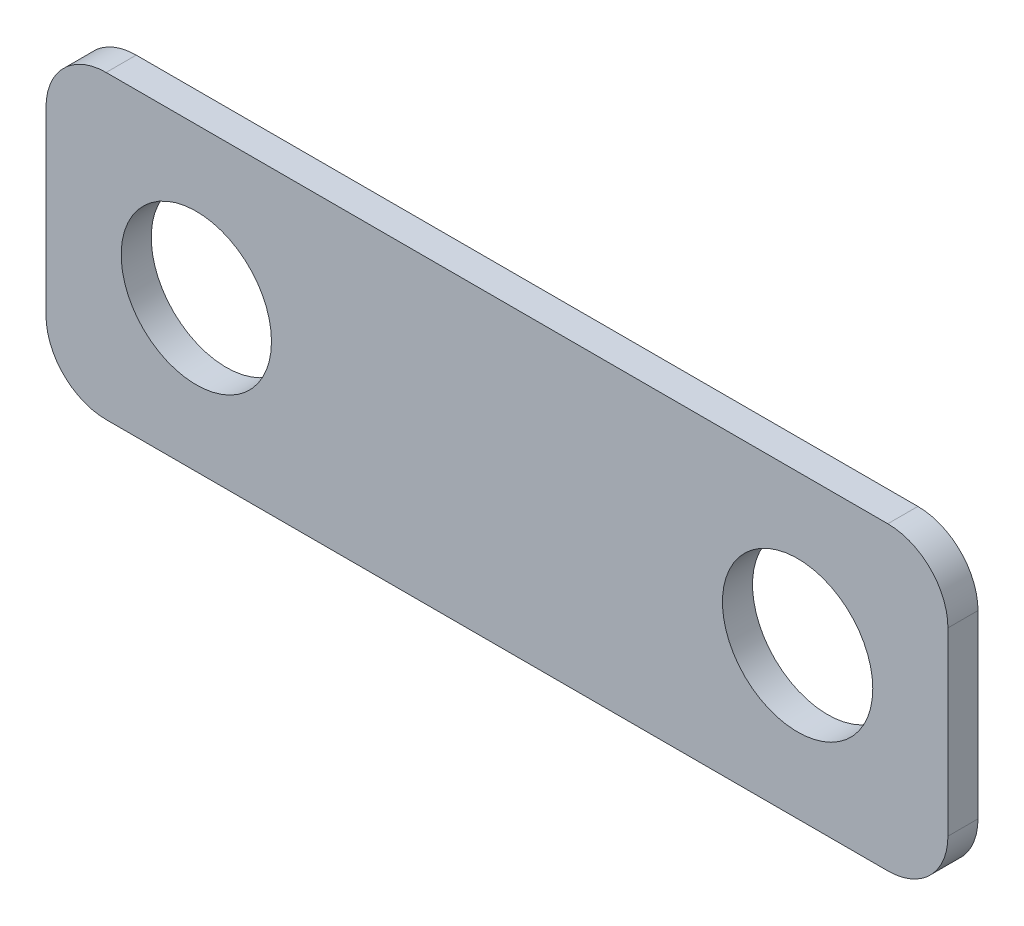
ISO-10303-21;
HEADER;
FILE_DESCRIPTION(('STEP AP214'),'2;1');
FILE_NAME('part.step','',(''),(''),'','','');
FILE_SCHEMA(('AUTOMOTIVE_DESIGN { 1 0 10303 214 1 1 1 1 }'));
ENDSEC;
DATA;
#1=APPLICATION_CONTEXT('core data for automotive mechanical design processes');
#2=APPLICATION_PROTOCOL_DEFINITION('international standard','automotive_design',2000,#1);
#3=PRODUCT_CONTEXT('',#1,'mechanical');
#4=PRODUCT('Part','Part','',(#3));
#5=PRODUCT_RELATED_PRODUCT_CATEGORY('part','',(#4));
#6=PRODUCT_DEFINITION_FORMATION('','',#4);
#7=PRODUCT_DEFINITION_CONTEXT('part definition',#1,'design');
#8=PRODUCT_DEFINITION('design','',#6,#7);
#9=PRODUCT_DEFINITION_SHAPE('','',#8);
#10=(LENGTH_UNIT() NAMED_UNIT(*) SI_UNIT(.MILLI.,.METRE.));
#11=(NAMED_UNIT(*) PLANE_ANGLE_UNIT() SI_UNIT($,.RADIAN.));
#12=(NAMED_UNIT(*) SI_UNIT($,.STERADIAN.) SOLID_ANGLE_UNIT());
#13=UNCERTAINTY_MEASURE_WITH_UNIT(LENGTH_MEASURE(1.E-05),#10,'distance_accuracy_value','');
#14=(GEOMETRIC_REPRESENTATION_CONTEXT(3) GLOBAL_UNCERTAINTY_ASSIGNED_CONTEXT((#13)) GLOBAL_UNIT_ASSIGNED_CONTEXT((#10,
#11,#12)) REPRESENTATION_CONTEXT('',''));
#15=CARTESIAN_POINT('',(0.,0.,0.));
#16=DIRECTION('',(0.,0.,1.));
#17=DIRECTION('',(1.,0.,0.));
#18=AXIS2_PLACEMENT_3D('',#15,#16,#17);
#19=CARTESIAN_POINT('',(13.,3.,1.));
#20=DIRECTION('',(0.,0.,-1.));
#21=DIRECTION('',(-1.,0.,0.));
#22=AXIS2_PLACEMENT_3D('',#19,#20,#21);
#23=PLANE('',#22);
#24=CARTESIAN_POINT('',(13.,3.,1.));
#25=DIRECTION('',(0.,0.,1.));
#26=DIRECTION('',(-1.,0.,0.));
#27=AXIS2_PLACEMENT_3D('',#24,#25,#26);
#28=CIRCLE('',#27,2.);
#29=CARTESIAN_POINT('',(15.,3.,1.));
#30=VERTEX_POINT('',#29);
#31=CARTESIAN_POINT('',(13.,5.,1.));
#32=VERTEX_POINT('',#31);
#33=EDGE_CURVE('E146',#30,#32,#28,.T.);
#34=ORIENTED_EDGE('',*,*,#33,.T.);
#35=DIRECTION('',(-1.,0.,0.));
#36=VECTOR('',#35,1.);
#37=CARTESIAN_POINT('',(-13.,5.,1.));
#38=LINE('',#37,#36);
#39=CARTESIAN_POINT('',(-13.,5.,1.));
#40=VERTEX_POINT('',#39);
#41=EDGE_CURVE('E94',#32,#40,#38,.T.);
#42=ORIENTED_EDGE('',*,*,#41,.T.);
#43=CARTESIAN_POINT('',(-13.,3.,1.));
#44=DIRECTION('',(0.,0.,1.));
#45=DIRECTION('',(-1.,0.,0.));
#46=AXIS2_PLACEMENT_3D('',#43,#44,#45);
#47=CIRCLE('',#46,2.);
#48=CARTESIAN_POINT('',(-15.,3.,1.));
#49=VERTEX_POINT('',#48);
#50=EDGE_CURVE('E161',#40,#49,#47,.T.);
#51=ORIENTED_EDGE('',*,*,#50,.T.);
#52=DIRECTION('',(0.,-1.,0.));
#53=VECTOR('',#52,1.);
#54=CARTESIAN_POINT('',(-15.,-3.,1.));
#55=LINE('',#54,#53);
#56=CARTESIAN_POINT('',(-15.,-3.,1.));
#57=VERTEX_POINT('',#56);
#58=EDGE_CURVE('E174',#49,#57,#55,.T.);
#59=ORIENTED_EDGE('',*,*,#58,.T.);
#60=CARTESIAN_POINT('',(-13.,-3.,1.));
#61=DIRECTION('',(0.,0.,1.));
#62=DIRECTION('',(-1.,0.,0.));
#63=AXIS2_PLACEMENT_3D('',#60,#61,#62);
#64=CIRCLE('',#63,2.);
#65=CARTESIAN_POINT('',(-13.,-5.,1.));
#66=VERTEX_POINT('',#65);
#67=EDGE_CURVE('E113',#57,#66,#64,.T.);
#68=ORIENTED_EDGE('',*,*,#67,.T.);
#69=DIRECTION('',(1.,0.,0.));
#70=VECTOR('',#69,1.);
#71=CARTESIAN_POINT('',(-13.,-5.,1.));
#72=LINE('',#71,#70);
#73=CARTESIAN_POINT('',(13.,-5.,1.));
#74=VERTEX_POINT('',#73);
#75=EDGE_CURVE('E107',#66,#74,#72,.T.);
#76=ORIENTED_EDGE('',*,*,#75,.T.);
#77=CARTESIAN_POINT('',(13.,-3.,1.));
#78=DIRECTION('',(0.,0.,1.));
#79=DIRECTION('',(1.,0.,0.));
#80=AXIS2_PLACEMENT_3D('',#77,#78,#79);
#81=CIRCLE('',#80,2.);
#82=CARTESIAN_POINT('',(15.,-3.,1.));
#83=VERTEX_POINT('',#82);
#84=EDGE_CURVE('E111',#74,#83,#81,.T.);
#85=ORIENTED_EDGE('',*,*,#84,.T.);
#86=DIRECTION('',(0.,1.,0.));
#87=VECTOR('',#86,1.);
#88=CARTESIAN_POINT('',(15.,-3.,1.));
#89=LINE('',#88,#87);
#90=EDGE_CURVE('E51',#83,#30,#89,.T.);
#91=ORIENTED_EDGE('',*,*,#90,.T.);
#92=EDGE_LOOP('',(#34,#42,#51,#59,#68,#76,#85,#91));
#93=FACE_BOUND('',#92,.T.);
#94=CARTESIAN_POINT('',(-10.,0.,1.));
#95=DIRECTION('',(0.,0.,1.));
#96=DIRECTION('',(1.,0.,0.));
#97=AXIS2_PLACEMENT_3D('',#94,#95,#96);
#98=CIRCLE('',#97,2.5);
#99=CARTESIAN_POINT('',(-7.5,0.,1.));
#100=VERTEX_POINT('',#99);
#101=EDGE_CURVE('E135',#100,#100,#98,.T.);
#102=ORIENTED_EDGE('',*,*,#101,.F.);
#103=EDGE_LOOP('',(#102));
#104=FACE_BOUND('',#103,.T.);
#105=CARTESIAN_POINT('',(10.,0.,1.));
#106=DIRECTION('',(0.,0.,1.));
#107=DIRECTION('',(1.,0.,0.));
#108=AXIS2_PLACEMENT_3D('',#105,#106,#107);
#109=CIRCLE('',#108,2.5);
#110=CARTESIAN_POINT('',(12.5,0.,1.));
#111=VERTEX_POINT('',#110);
#112=EDGE_CURVE('E183',#111,#111,#109,.T.);
#113=ORIENTED_EDGE('',*,*,#112,.F.);
#114=EDGE_LOOP('',(#113));
#115=FACE_BOUND('',#114,.T.);
#116=ADVANCED_FACE('F34',(#93,#104,#115),#23,.F.);
#117=CARTESIAN_POINT('',(13.,3.,0.));
#118=DIRECTION('',(0.,0.,-1.));
#119=DIRECTION('',(-1.,0.,0.));
#120=AXIS2_PLACEMENT_3D('',#117,#118,#119);
#121=PLANE('',#120);
#122=CARTESIAN_POINT('',(-10.,0.,0.));
#123=DIRECTION('',(0.,0.,1.));
#124=DIRECTION('',(1.,0.,0.));
#125=AXIS2_PLACEMENT_3D('',#122,#123,#124);
#126=CIRCLE('',#125,2.5);
#127=CARTESIAN_POINT('',(-7.5,0.,0.));
#128=VERTEX_POINT('',#127);
#129=EDGE_CURVE('E180',#128,#128,#126,.T.);
#130=ORIENTED_EDGE('',*,*,#129,.T.);
#131=EDGE_LOOP('',(#130));
#132=FACE_BOUND('',#131,.T.);
#133=CARTESIAN_POINT('',(13.,3.,0.));
#134=DIRECTION('',(0.,0.,1.));
#135=DIRECTION('',(-1.,0.,0.));
#136=AXIS2_PLACEMENT_3D('',#133,#134,#135);
#137=CIRCLE('',#136,2.);
#138=CARTESIAN_POINT('',(15.,3.,0.));
#139=VERTEX_POINT('',#138);
#140=CARTESIAN_POINT('',(13.,5.,0.));
#141=VERTEX_POINT('',#140);
#142=EDGE_CURVE('E131',#139,#141,#137,.T.);
#143=ORIENTED_EDGE('',*,*,#142,.F.);
#144=DIRECTION('',(0.,1.,0.));
#145=VECTOR('',#144,1.);
#146=CARTESIAN_POINT('',(15.,-3.,0.));
#147=LINE('',#146,#145);
#148=CARTESIAN_POINT('',(15.,-3.,0.));
#149=VERTEX_POINT('',#148);
#150=EDGE_CURVE('E86',#149,#139,#147,.T.);
#151=ORIENTED_EDGE('',*,*,#150,.F.);
#152=CARTESIAN_POINT('',(13.,-3.,0.));
#153=DIRECTION('',(0.,0.,1.));
#154=DIRECTION('',(1.,0.,0.));
#155=AXIS2_PLACEMENT_3D('',#152,#153,#154);
#156=CIRCLE('',#155,2.);
#157=CARTESIAN_POINT('',(13.,-5.,0.));
#158=VERTEX_POINT('',#157);
#159=EDGE_CURVE('E80',#158,#149,#156,.T.);
#160=ORIENTED_EDGE('',*,*,#159,.F.);
#161=DIRECTION('',(1.,0.,0.));
#162=VECTOR('',#161,1.);
#163=CARTESIAN_POINT('',(-13.,-5.,0.));
#164=LINE('',#163,#162);
#165=CARTESIAN_POINT('',(-13.,-5.,0.));
#166=VERTEX_POINT('',#165);
#167=EDGE_CURVE('E121',#166,#158,#164,.T.);
#168=ORIENTED_EDGE('',*,*,#167,.F.);
#169=CARTESIAN_POINT('',(-13.,-3.,0.));
#170=DIRECTION('',(0.,0.,1.));
#171=DIRECTION('',(-1.,0.,0.));
#172=AXIS2_PLACEMENT_3D('',#169,#170,#171);
#173=CIRCLE('',#172,2.);
#174=CARTESIAN_POINT('',(-15.,-3.,0.));
#175=VERTEX_POINT('',#174);
#176=EDGE_CURVE('E141',#175,#166,#173,.T.);
#177=ORIENTED_EDGE('',*,*,#176,.F.);
#178=DIRECTION('',(0.,-1.,0.));
#179=VECTOR('',#178,1.);
#180=CARTESIAN_POINT('',(-15.,-3.,0.));
#181=LINE('',#180,#179);
#182=CARTESIAN_POINT('',(-15.,3.,0.));
#183=VERTEX_POINT('',#182);
#184=EDGE_CURVE('E139',#183,#175,#181,.T.);
#185=ORIENTED_EDGE('',*,*,#184,.F.);
#186=CARTESIAN_POINT('',(-13.,3.,0.));
#187=DIRECTION('',(0.,0.,1.));
#188=DIRECTION('',(-1.,0.,0.));
#189=AXIS2_PLACEMENT_3D('',#186,#187,#188);
#190=CIRCLE('',#189,2.);
#191=CARTESIAN_POINT('',(-13.,5.,0.));
#192=VERTEX_POINT('',#191);
#193=EDGE_CURVE('E137',#192,#183,#190,.T.);
#194=ORIENTED_EDGE('',*,*,#193,.F.);
#195=DIRECTION('',(-1.,0.,0.));
#196=VECTOR('',#195,1.);
#197=CARTESIAN_POINT('',(-13.,5.,0.));
#198=LINE('',#197,#196);
#199=EDGE_CURVE('E134',#141,#192,#198,.T.);
#200=ORIENTED_EDGE('',*,*,#199,.F.);
#201=EDGE_LOOP('',(#143,#151,#160,#168,#177,#185,#194,#200));
#202=FACE_BOUND('',#201,.T.);
#203=CARTESIAN_POINT('',(10.,0.,0.));
#204=DIRECTION('',(0.,0.,1.));
#205=DIRECTION('',(1.,0.,0.));
#206=AXIS2_PLACEMENT_3D('',#203,#204,#205);
#207=CIRCLE('',#206,2.5);
#208=CARTESIAN_POINT('',(12.5,0.,0.));
#209=VERTEX_POINT('',#208);
#210=EDGE_CURVE('E186',#209,#209,#207,.T.);
#211=ORIENTED_EDGE('',*,*,#210,.T.);
#212=EDGE_LOOP('',(#211));
#213=FACE_BOUND('',#212,.T.);
#214=ADVANCED_FACE('F165',(#132,#202,#213),#121,.T.);
#215=CARTESIAN_POINT('',(13.,3.,1.));
#216=DIRECTION('',(0.,0.,-1.));
#217=DIRECTION('',(-1.,0.,0.));
#218=AXIS2_PLACEMENT_3D('',#215,#216,#217);
#219=CYLINDRICAL_SURFACE('',#218,2.);
#220=ORIENTED_EDGE('',*,*,#142,.T.);
#221=DIRECTION('',(0.,0.,-1.));
#222=VECTOR('',#221,1.);
#223=CARTESIAN_POINT('',(13.,5.,1.));
#224=LINE('',#223,#222);
#225=EDGE_CURVE('E11',#32,#141,#224,.T.);
#226=ORIENTED_EDGE('',*,*,#225,.F.);
#227=ORIENTED_EDGE('',*,*,#33,.F.);
#228=DIRECTION('',(0.,0.,-1.));
#229=VECTOR('',#228,1.);
#230=CARTESIAN_POINT('',(15.,3.,1.));
#231=LINE('',#230,#229);
#232=EDGE_CURVE('E127',#30,#139,#231,.T.);
#233=ORIENTED_EDGE('',*,*,#232,.T.);
#234=EDGE_LOOP('',(#220,#226,#227,#233));
#235=FACE_BOUND('',#234,.T.);
#236=ADVANCED_FACE('F36',(#235),#219,.T.);
#237=CARTESIAN_POINT('',(-13.,5.,1.));
#238=DIRECTION('',(0.,-1.,0.));
#239=DIRECTION('',(0.,0.,-1.));
#240=AXIS2_PLACEMENT_3D('',#237,#238,#239);
#241=PLANE('',#240);
#242=ORIENTED_EDGE('',*,*,#199,.T.);
#243=DIRECTION('',(0.,0.,-1.));
#244=VECTOR('',#243,1.);
#245=CARTESIAN_POINT('',(-13.,5.,1.));
#246=LINE('',#245,#244);
#247=EDGE_CURVE('E43',#40,#192,#246,.T.);
#248=ORIENTED_EDGE('',*,*,#247,.F.);
#249=ORIENTED_EDGE('',*,*,#41,.F.);
#250=ORIENTED_EDGE('',*,*,#225,.T.);
#251=EDGE_LOOP('',(#242,#248,#249,#250));
#252=FACE_BOUND('',#251,.T.);
#253=ADVANCED_FACE('F218',(#252),#241,.F.);
#254=CARTESIAN_POINT('',(-13.,3.,1.));
#255=DIRECTION('',(0.,0.,-1.));
#256=DIRECTION('',(-1.,0.,0.));
#257=AXIS2_PLACEMENT_3D('',#254,#255,#256);
#258=CYLINDRICAL_SURFACE('',#257,2.);
#259=ORIENTED_EDGE('',*,*,#193,.T.);
#260=DIRECTION('',(0.,0.,-1.));
#261=VECTOR('',#260,1.);
#262=CARTESIAN_POINT('',(-15.,3.,1.));
#263=LINE('',#262,#261);
#264=EDGE_CURVE('E153',#49,#183,#263,.T.);
#265=ORIENTED_EDGE('',*,*,#264,.F.);
#266=ORIENTED_EDGE('',*,*,#50,.F.);
#267=ORIENTED_EDGE('',*,*,#247,.T.);
#268=EDGE_LOOP('',(#259,#265,#266,#267));
#269=FACE_BOUND('',#268,.T.);
#270=ADVANCED_FACE('F159',(#269),#258,.T.);
#271=CARTESIAN_POINT('',(-15.,-3.,1.));
#272=DIRECTION('',(1.,0.,0.));
#273=DIRECTION('',(0.,0.,-1.));
#274=AXIS2_PLACEMENT_3D('',#271,#272,#273);
#275=PLANE('',#274);
#276=ORIENTED_EDGE('',*,*,#184,.T.);
#277=DIRECTION('',(0.,0.,-1.));
#278=VECTOR('',#277,1.);
#279=CARTESIAN_POINT('',(-15.,-3.,1.));
#280=LINE('',#279,#278);
#281=EDGE_CURVE('E150',#57,#175,#280,.T.);
#282=ORIENTED_EDGE('',*,*,#281,.F.);
#283=ORIENTED_EDGE('',*,*,#58,.F.);
#284=ORIENTED_EDGE('',*,*,#264,.T.);
#285=EDGE_LOOP('',(#276,#282,#283,#284));
#286=FACE_BOUND('',#285,.T.);
#287=ADVANCED_FACE('F170',(#286),#275,.F.);
#288=CARTESIAN_POINT('',(-13.,-3.,1.));
#289=DIRECTION('',(0.,0.,-1.));
#290=DIRECTION('',(-1.,0.,0.));
#291=AXIS2_PLACEMENT_3D('',#288,#289,#290);
#292=CYLINDRICAL_SURFACE('',#291,2.);
#293=ORIENTED_EDGE('',*,*,#176,.T.);
#294=DIRECTION('',(0.,0.,-1.));
#295=VECTOR('',#294,1.);
#296=CARTESIAN_POINT('',(-13.,-5.,1.));
#297=LINE('',#296,#295);
#298=EDGE_CURVE('E122',#66,#166,#297,.T.);
#299=ORIENTED_EDGE('',*,*,#298,.F.);
#300=ORIENTED_EDGE('',*,*,#67,.F.);
#301=ORIENTED_EDGE('',*,*,#281,.T.);
#302=EDGE_LOOP('',(#293,#299,#300,#301));
#303=FACE_BOUND('',#302,.T.);
#304=ADVANCED_FACE('F173',(#303),#292,.T.);
#305=CARTESIAN_POINT('',(-13.,-5.,1.));
#306=DIRECTION('',(0.,1.,0.));
#307=DIRECTION('',(0.,0.,1.));
#308=AXIS2_PLACEMENT_3D('',#305,#306,#307);
#309=PLANE('',#308);
#310=ORIENTED_EDGE('',*,*,#167,.T.);
#311=DIRECTION('',(0.,0.,-1.));
#312=VECTOR('',#311,1.);
#313=CARTESIAN_POINT('',(13.,-5.,1.));
#314=LINE('',#313,#312);
#315=EDGE_CURVE('E118',#74,#158,#314,.T.);
#316=ORIENTED_EDGE('',*,*,#315,.F.);
#317=ORIENTED_EDGE('',*,*,#75,.F.);
#318=ORIENTED_EDGE('',*,*,#298,.T.);
#319=EDGE_LOOP('',(#310,#316,#317,#318));
#320=FACE_BOUND('',#319,.T.);
#321=ADVANCED_FACE('F119',(#320),#309,.F.);
#322=CARTESIAN_POINT('',(13.,-3.,1.));
#323=DIRECTION('',(0.,0.,-1.));
#324=DIRECTION('',(-1.,0.,0.));
#325=AXIS2_PLACEMENT_3D('',#322,#323,#324);
#326=CYLINDRICAL_SURFACE('',#325,2.);
#327=ORIENTED_EDGE('',*,*,#159,.T.);
#328=DIRECTION('',(0.,0.,-1.));
#329=VECTOR('',#328,1.);
#330=CARTESIAN_POINT('',(15.,-3.,1.));
#331=LINE('',#330,#329);
#332=EDGE_CURVE('E123',#83,#149,#331,.T.);
#333=ORIENTED_EDGE('',*,*,#332,.F.);
#334=ORIENTED_EDGE('',*,*,#84,.F.);
#335=ORIENTED_EDGE('',*,*,#315,.T.);
#336=EDGE_LOOP('',(#327,#333,#334,#335));
#337=FACE_BOUND('',#336,.T.);
#338=ADVANCED_FACE('F125',(#337),#326,.T.);
#339=CARTESIAN_POINT('',(15.,-3.,1.));
#340=DIRECTION('',(-1.,0.,0.));
#341=DIRECTION('',(0.,0.,1.));
#342=AXIS2_PLACEMENT_3D('',#339,#340,#341);
#343=PLANE('',#342);
#344=ORIENTED_EDGE('',*,*,#150,.T.);
#345=ORIENTED_EDGE('',*,*,#232,.F.);
#346=ORIENTED_EDGE('',*,*,#90,.F.);
#347=ORIENTED_EDGE('',*,*,#332,.T.);
#348=EDGE_LOOP('',(#344,#345,#346,#347));
#349=FACE_BOUND('',#348,.T.);
#350=ADVANCED_FACE('F206',(#349),#343,.F.);
#351=CARTESIAN_POINT('',(-10.,0.,1.));
#352=DIRECTION('',(0.,0.,-1.));
#353=DIRECTION('',(-1.,0.,0.));
#354=AXIS2_PLACEMENT_3D('',#351,#352,#353);
#355=CYLINDRICAL_SURFACE('',#354,2.5);
#356=ORIENTED_EDGE('',*,*,#101,.T.);
#357=EDGE_LOOP('',(#356));
#358=FACE_BOUND('',#357,.T.);
#359=ORIENTED_EDGE('',*,*,#129,.F.);
#360=EDGE_LOOP('',(#359));
#361=FACE_BOUND('',#360,.T.);
#362=ADVANCED_FACE('F203',(#358,#361),#355,.F.);
#363=CARTESIAN_POINT('',(10.,0.,1.));
#364=DIRECTION('',(0.,0.,-1.));
#365=DIRECTION('',(-1.,0.,0.));
#366=AXIS2_PLACEMENT_3D('',#363,#364,#365);
#367=CYLINDRICAL_SURFACE('',#366,2.5);
#368=ORIENTED_EDGE('',*,*,#112,.T.);
#369=EDGE_LOOP('',(#368));
#370=FACE_BOUND('',#369,.T.);
#371=ORIENTED_EDGE('',*,*,#210,.F.);
#372=EDGE_LOOP('',(#371));
#373=FACE_BOUND('',#372,.T.);
#374=ADVANCED_FACE('F192',(#370,#373),#367,.F.);
#375=CLOSED_SHELL('',(#116,#214,#236,#253,#270,#287,#304,#321,#338,#350,#362,#374));
#376=MANIFOLD_SOLID_BREP('B2',#375);
#377=ADVANCED_BREP_SHAPE_REPRESENTATION('',(#18,#376),#14);
#378=SHAPE_DEFINITION_REPRESENTATION(#9,#377);
ENDSEC;
END-ISO-10303-21;
